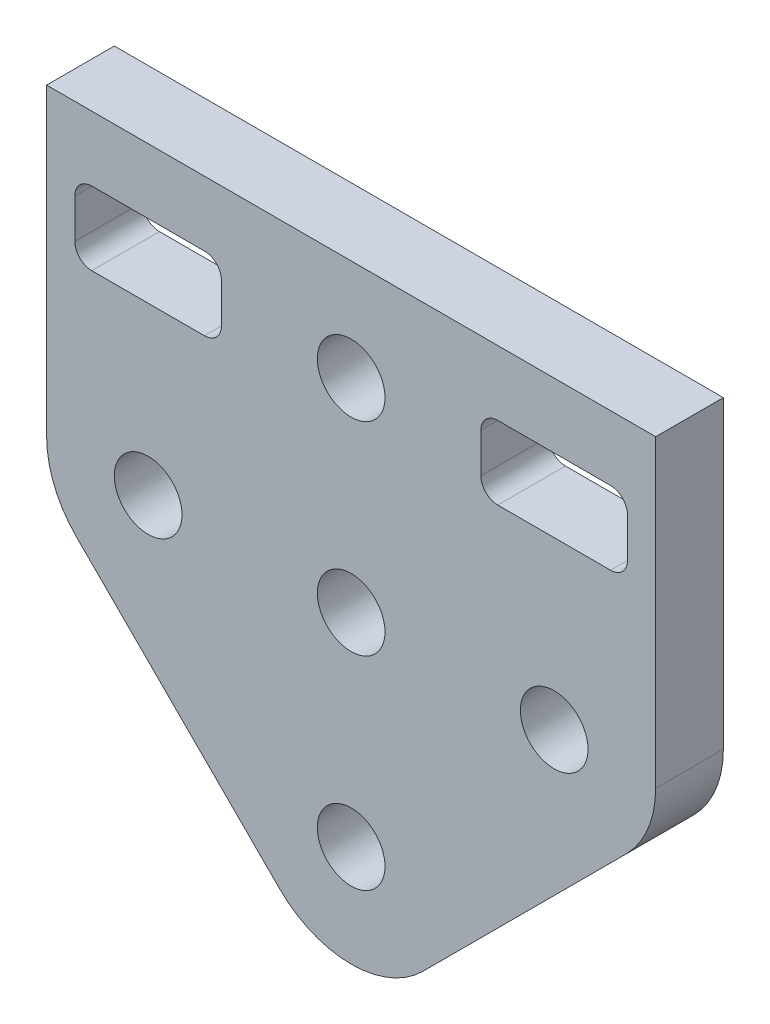
ISO-10303-21;
HEADER;
FILE_DESCRIPTION(('STEP AP214'),'2;1');
FILE_NAME('part.step','',(''),(''),'','','');
FILE_SCHEMA(('AUTOMOTIVE_DESIGN { 1 0 10303 214 1 1 1 1 }'));
ENDSEC;
DATA;
#1=APPLICATION_CONTEXT('core data for automotive mechanical design processes');
#2=APPLICATION_PROTOCOL_DEFINITION('international standard','automotive_design',2000,#1);
#3=PRODUCT_CONTEXT('',#1,'mechanical');
#4=PRODUCT('Part','Part','',(#3));
#5=PRODUCT_RELATED_PRODUCT_CATEGORY('part','',(#4));
#6=PRODUCT_DEFINITION_FORMATION('','',#4);
#7=PRODUCT_DEFINITION_CONTEXT('part definition',#1,'design');
#8=PRODUCT_DEFINITION('design','',#6,#7);
#9=PRODUCT_DEFINITION_SHAPE('','',#8);
#10=(LENGTH_UNIT() NAMED_UNIT(*) SI_UNIT(.MILLI.,.METRE.));
#11=(NAMED_UNIT(*) PLANE_ANGLE_UNIT() SI_UNIT($,.RADIAN.));
#12=(NAMED_UNIT(*) SI_UNIT($,.STERADIAN.) SOLID_ANGLE_UNIT());
#13=UNCERTAINTY_MEASURE_WITH_UNIT(LENGTH_MEASURE(1.E-05),#10,'distance_accuracy_value','');
#14=(GEOMETRIC_REPRESENTATION_CONTEXT(3) GLOBAL_UNCERTAINTY_ASSIGNED_CONTEXT((#13)) GLOBAL_UNIT_ASSIGNED_CONTEXT((#10,
#11,#12)) REPRESENTATION_CONTEXT('',''));
#15=CARTESIAN_POINT('',(0.,0.,0.));
#16=DIRECTION('',(0.,0.,1.));
#17=DIRECTION('',(1.,0.,0.));
#18=AXIS2_PLACEMENT_3D('',#15,#16,#17);
#19=CARTESIAN_POINT('',(187.7270545748,195.1787200631,3.));
#20=DIRECTION('',(0.,0.,1.));
#21=DIRECTION('',(1.,0.,0.));
#22=AXIS2_PLACEMENT_3D('',#19,#20,#21);
#23=PLANE('',#22);
#24=DIRECTION('',(0.,-1.,0.));
#25=VECTOR('',#24,1.);
#26=CARTESIAN_POINT('',(193.4770545748,214.0537200631,3.));
#27=LINE('',#26,#25);
#28=CARTESIAN_POINT('',(193.4770545748,214.0537200631,3.));
#29=VERTEX_POINT('',#28);
#30=CARTESIAN_POINT('',(193.4770545748,212.3037200631,3.));
#31=VERTEX_POINT('',#30);
#32=EDGE_CURVE('E261',#29,#31,#27,.T.);
#33=ORIENTED_EDGE('',*,*,#32,.F.);
#34=CARTESIAN_POINT('',(194.2270545748,214.0537200631,3.));
#35=DIRECTION('',(0.,0.,1.));
#36=DIRECTION('',(1.,0.,0.));
#37=AXIS2_PLACEMENT_3D('',#34,#35,#36);
#38=CIRCLE('',#37,0.750000000000001);
#39=CARTESIAN_POINT('',(194.2270545748,214.8037200631,3.));
#40=VERTEX_POINT('',#39);
#41=EDGE_CURVE('E259',#40,#29,#38,.T.);
#42=ORIENTED_EDGE('',*,*,#41,.F.);
#43=DIRECTION('',(-1.,0.,0.));
#44=VECTOR('',#43,1.);
#45=CARTESIAN_POINT('',(199.2270545748,214.8037200631,3.));
#46=LINE('',#45,#44);
#47=CARTESIAN_POINT('',(199.2270545748,214.8037200631,3.));
#48=VERTEX_POINT('',#47);
#49=EDGE_CURVE('E275',#48,#40,#46,.T.);
#50=ORIENTED_EDGE('',*,*,#49,.F.);
#51=CARTESIAN_POINT('',(199.2270545748,214.0537200631,3.));
#52=DIRECTION('',(0.,0.,1.));
#53=DIRECTION('',(1.,0.,0.));
#54=AXIS2_PLACEMENT_3D('',#51,#52,#53);
#55=CIRCLE('',#54,0.750000000000001);
#56=CARTESIAN_POINT('',(199.9770545748,214.0537200631,3.));
#57=VERTEX_POINT('',#56);
#58=EDGE_CURVE('E272',#57,#48,#55,.T.);
#59=ORIENTED_EDGE('',*,*,#58,.F.);
#60=DIRECTION('',(0.,1.,0.));
#61=VECTOR('',#60,1.);
#62=CARTESIAN_POINT('',(199.9770545748,212.3037200631,3.));
#63=LINE('',#62,#61);
#64=CARTESIAN_POINT('',(199.9770545748,212.3037200631,3.));
#65=VERTEX_POINT('',#64);
#66=EDGE_CURVE('E270',#65,#57,#63,.T.);
#67=ORIENTED_EDGE('',*,*,#66,.F.);
#68=CARTESIAN_POINT('',(199.2270545748,212.3037200631,3.));
#69=DIRECTION('',(0.,0.,1.));
#70=DIRECTION('',(1.,0.,0.));
#71=AXIS2_PLACEMENT_3D('',#68,#69,#70);
#72=CIRCLE('',#71,0.750000000000001);
#73=CARTESIAN_POINT('',(199.2270545748,211.5537200631,3.));
#74=VERTEX_POINT('',#73);
#75=EDGE_CURVE('E268',#74,#65,#72,.T.);
#76=ORIENTED_EDGE('',*,*,#75,.F.);
#77=DIRECTION('',(1.,0.,0.));
#78=VECTOR('',#77,1.);
#79=CARTESIAN_POINT('',(194.2270545748,211.5537200631,3.));
#80=LINE('',#79,#78);
#81=CARTESIAN_POINT('',(194.2270545748,211.5537200631,3.));
#82=VERTEX_POINT('',#81);
#83=EDGE_CURVE('E266',#82,#74,#80,.T.);
#84=ORIENTED_EDGE('',*,*,#83,.F.);
#85=CARTESIAN_POINT('',(194.2270545748,212.3037200631,3.));
#86=DIRECTION('',(0.,0.,1.));
#87=DIRECTION('',(1.,0.,0.));
#88=AXIS2_PLACEMENT_3D('',#85,#86,#87);
#89=CIRCLE('',#88,0.750000000000001);
#90=EDGE_CURVE('E264',#31,#82,#89,.T.);
#91=ORIENTED_EDGE('',*,*,#90,.F.);
#92=EDGE_LOOP('',(#33,#42,#50,#59,#67,#76,#84,#91));
#93=FACE_BOUND('',#92,.T.);
#94=CARTESIAN_POINT('',(187.7270545748,195.1787200631,3.));
#95=DIRECTION('',(0.,0.,1.));
#96=DIRECTION('',(1.,0.,0.));
#97=AXIS2_PLACEMENT_3D('',#94,#95,#96);
#98=CIRCLE('',#97,1.5);
#99=CARTESIAN_POINT('',(189.2270545748,195.1787200631,3.));
#100=VERTEX_POINT('',#99);
#101=EDGE_CURVE('E324',#100,#100,#98,.T.);
#102=ORIENTED_EDGE('',*,*,#101,.F.);
#103=EDGE_LOOP('',(#102));
#104=FACE_BOUND('',#103,.T.);
#105=CARTESIAN_POINT('',(178.7270545748,204.1787200631,3.));
#106=DIRECTION('',(0.,0.,1.));
#107=DIRECTION('',(1.,0.,0.));
#108=AXIS2_PLACEMENT_3D('',#105,#106,#107);
#109=CIRCLE('',#108,1.5);
#110=CARTESIAN_POINT('',(180.2270545748,204.1787200631,3.));
#111=VERTEX_POINT('',#110);
#112=EDGE_CURVE('E336',#111,#111,#109,.T.);
#113=ORIENTED_EDGE('',*,*,#112,.F.);
#114=EDGE_LOOP('',(#113));
#115=FACE_BOUND('',#114,.T.);
#116=CARTESIAN_POINT('',(187.7270545748,195.1787200631,3.));
#117=DIRECTION('',(0.,0.,1.));
#118=DIRECTION('',(1.,0.,0.));
#119=AXIS2_PLACEMENT_3D('',#116,#117,#118);
#120=CIRCLE('',#119,4.50000000005025);
#121=CARTESIAN_POINT('',(184.5450740594,191.9967395477,3.));
#122=VERTEX_POINT('',#121);
#123=CARTESIAN_POINT('',(190.9090350901,191.9967395477,3.));
#124=VERTEX_POINT('',#123);
#125=EDGE_CURVE('E348',#122,#124,#120,.T.);
#126=ORIENTED_EDGE('',*,*,#125,.T.);
#127=DIRECTION('',(0.707106781186548,0.707106781186548,0.));
#128=VECTOR('',#127,1.);
#129=CARTESIAN_POINT('',(190.9090350901,191.9967395477,3.));
#130=LINE('',#129,#128);
#131=CARTESIAN_POINT('',(199.909035090095,200.996739547705,3.));
#132=VERTEX_POINT('',#131);
#133=EDGE_CURVE('E351',#124,#132,#130,.T.);
#134=ORIENTED_EDGE('',*,*,#133,.T.);
#135=CARTESIAN_POINT('',(196.7270545748,204.1787200631,3.));
#136=DIRECTION('',(0.,0.,1.));
#137=DIRECTION('',(1.,0.,0.));
#138=AXIS2_PLACEMENT_3D('',#135,#136,#137);
#139=CIRCLE('',#138,4.50000000000745);
#140=CARTESIAN_POINT('',(201.2270545748,204.1787200631,3.));
#141=VERTEX_POINT('',#140);
#142=EDGE_CURVE('E354',#132,#141,#139,.T.);
#143=ORIENTED_EDGE('',*,*,#142,.T.);
#144=DIRECTION('',(0.,1.,0.));
#145=VECTOR('',#144,1.);
#146=CARTESIAN_POINT('',(201.2270545748,217.6787200631,3.));
#147=LINE('',#146,#145);
#148=CARTESIAN_POINT('',(201.2270545748,217.6787200631,3.));
#149=VERTEX_POINT('',#148);
#150=EDGE_CURVE('E356',#141,#149,#147,.T.);
#151=ORIENTED_EDGE('',*,*,#150,.T.);
#152=DIRECTION('',(-1.,0.,0.));
#153=VECTOR('',#152,1.);
#154=CARTESIAN_POINT('',(201.2270545748,217.6787200631,3.));
#155=LINE('',#154,#153);
#156=CARTESIAN_POINT('',(174.2270545748,217.6787200631,3.));
#157=VERTEX_POINT('',#156);
#158=EDGE_CURVE('E358',#149,#157,#155,.T.);
#159=ORIENTED_EDGE('',*,*,#158,.T.);
#160=DIRECTION('',(0.,-1.,0.));
#161=VECTOR('',#160,1.);
#162=CARTESIAN_POINT('',(174.2270545748,213.1787200631,3.));
#163=LINE('',#162,#161);
#164=CARTESIAN_POINT('',(174.227054574757,204.1787200631,3.));
#165=VERTEX_POINT('',#164);
#166=EDGE_CURVE('E360',#157,#165,#163,.T.);
#167=ORIENTED_EDGE('',*,*,#166,.T.);
#168=CARTESIAN_POINT('',(178.7270545748,204.1787200631,3.));
#169=DIRECTION('',(0.,0.,1.));
#170=DIRECTION('',(1.,0.,0.));
#171=AXIS2_PLACEMENT_3D('',#168,#169,#170);
#172=CIRCLE('',#171,4.50000000004281);
#173=CARTESIAN_POINT('',(175.5450740594,200.9967395477,3.));
#174=VERTEX_POINT('',#173);
#175=EDGE_CURVE('E362',#165,#174,#172,.T.);
#176=ORIENTED_EDGE('',*,*,#175,.T.);
#177=DIRECTION('',(0.707106781186548,-0.707106781186548,0.));
#178=VECTOR('',#177,1.);
#179=CARTESIAN_POINT('',(184.5450740594,191.9967395477,3.));
#180=LINE('',#179,#178);
#181=EDGE_CURVE('E364',#174,#122,#180,.T.);
#182=ORIENTED_EDGE('',*,*,#181,.T.);
#183=EDGE_LOOP('',(#126,#134,#143,#151,#159,#167,#176,#182));
#184=FACE_BOUND('',#183,.T.);
#185=CARTESIAN_POINT('',(187.7270545748,204.1787200631,3.));
#186=DIRECTION('',(0.,0.,1.));
#187=DIRECTION('',(1.,0.,0.));
#188=AXIS2_PLACEMENT_3D('',#185,#186,#187);
#189=CIRCLE('',#188,1.5);
#190=CARTESIAN_POINT('',(189.2270545748,204.1787200631,3.));
#191=VERTEX_POINT('',#190);
#192=EDGE_CURVE('E342',#191,#191,#189,.T.);
#193=ORIENTED_EDGE('',*,*,#192,.F.);
#194=EDGE_LOOP('',(#193));
#195=FACE_BOUND('',#194,.T.);
#196=CARTESIAN_POINT('',(187.7270545748,213.1787200631,3.));
#197=DIRECTION('',(0.,0.,1.));
#198=DIRECTION('',(1.,0.,0.));
#199=AXIS2_PLACEMENT_3D('',#196,#197,#198);
#200=CIRCLE('',#199,1.5);
#201=CARTESIAN_POINT('',(189.2270545748,213.1787200631,3.));
#202=VERTEX_POINT('',#201);
#203=EDGE_CURVE('E330',#202,#202,#200,.T.);
#204=ORIENTED_EDGE('',*,*,#203,.F.);
#205=EDGE_LOOP('',(#204));
#206=FACE_BOUND('',#205,.T.);
#207=CARTESIAN_POINT('',(196.7270545748,204.1787200631,3.));
#208=DIRECTION('',(0.,0.,1.));
#209=DIRECTION('',(1.,0.,0.));
#210=AXIS2_PLACEMENT_3D('',#207,#208,#209);
#211=CIRCLE('',#210,1.5);
#212=CARTESIAN_POINT('',(198.2270545748,204.1787200631,3.));
#213=VERTEX_POINT('',#212);
#214=EDGE_CURVE('E318',#213,#213,#211,.T.);
#215=ORIENTED_EDGE('',*,*,#214,.F.);
#216=EDGE_LOOP('',(#215));
#217=FACE_BOUND('',#216,.T.);
#218=DIRECTION('',(0.,-1.,0.));
#219=VECTOR('',#218,1.);
#220=CARTESIAN_POINT('',(175.4770545748,214.0537200631,3.));
#221=LINE('',#220,#219);
#222=CARTESIAN_POINT('',(175.4770545748,214.0537200631,3.));
#223=VERTEX_POINT('',#222);
#224=CARTESIAN_POINT('',(175.4770545748,212.3037200631,3.));
#225=VERTEX_POINT('',#224);
#226=EDGE_CURVE('E202',#223,#225,#221,.T.);
#227=ORIENTED_EDGE('',*,*,#226,.F.);
#228=CARTESIAN_POINT('',(176.2270545748,214.0537200631,3.));
#229=DIRECTION('',(0.,0.,1.));
#230=DIRECTION('',(1.,0.,0.));
#231=AXIS2_PLACEMENT_3D('',#228,#229,#230);
#232=CIRCLE('',#231,0.750000000000001);
#233=CARTESIAN_POINT('',(176.2270545748,214.8037200631,3.));
#234=VERTEX_POINT('',#233);
#235=EDGE_CURVE('E194',#234,#223,#232,.T.);
#236=ORIENTED_EDGE('',*,*,#235,.F.);
#237=DIRECTION('',(-1.,0.,0.));
#238=VECTOR('',#237,1.);
#239=CARTESIAN_POINT('',(181.2270545748,214.8037200631,3.));
#240=LINE('',#239,#238);
#241=CARTESIAN_POINT('',(181.2270545748,214.8037200631,3.));
#242=VERTEX_POINT('',#241);
#243=EDGE_CURVE('E227',#242,#234,#240,.T.);
#244=ORIENTED_EDGE('',*,*,#243,.F.);
#245=CARTESIAN_POINT('',(181.2270545748,214.0537200631,3.));
#246=DIRECTION('',(0.,0.,1.));
#247=DIRECTION('',(1.,0.,0.));
#248=AXIS2_PLACEMENT_3D('',#245,#246,#247);
#249=CIRCLE('',#248,0.750000000000001);
#250=CARTESIAN_POINT('',(181.9770545748,214.0537200631,3.));
#251=VERTEX_POINT('',#250);
#252=EDGE_CURVE('E225',#251,#242,#249,.T.);
#253=ORIENTED_EDGE('',*,*,#252,.F.);
#254=DIRECTION('',(0.,1.,0.));
#255=VECTOR('',#254,1.);
#256=CARTESIAN_POINT('',(181.9770545748,212.3037200631,3.));
#257=LINE('',#256,#255);
#258=CARTESIAN_POINT('',(181.9770545748,212.3037200631,3.));
#259=VERTEX_POINT('',#258);
#260=EDGE_CURVE('E223',#259,#251,#257,.T.);
#261=ORIENTED_EDGE('',*,*,#260,.F.);
#262=CARTESIAN_POINT('',(181.2270545748,212.3037200631,3.));
#263=DIRECTION('',(0.,0.,1.));
#264=DIRECTION('',(1.,0.,0.));
#265=AXIS2_PLACEMENT_3D('',#262,#263,#264);
#266=CIRCLE('',#265,0.750000000000001);
#267=CARTESIAN_POINT('',(181.2270545748,211.5537200631,3.));
#268=VERTEX_POINT('',#267);
#269=EDGE_CURVE('E221',#268,#259,#266,.T.);
#270=ORIENTED_EDGE('',*,*,#269,.F.);
#271=DIRECTION('',(1.,0.,0.));
#272=VECTOR('',#271,1.);
#273=CARTESIAN_POINT('',(176.2270545748,211.5537200631,3.));
#274=LINE('',#273,#272);
#275=CARTESIAN_POINT('',(176.2270545748,211.5537200631,3.));
#276=VERTEX_POINT('',#275);
#277=EDGE_CURVE('E217',#276,#268,#274,.T.);
#278=ORIENTED_EDGE('',*,*,#277,.F.);
#279=CARTESIAN_POINT('',(176.2270545748,212.3037200631,3.));
#280=DIRECTION('',(0.,0.,1.));
#281=DIRECTION('',(1.,0.,0.));
#282=AXIS2_PLACEMENT_3D('',#279,#280,#281);
#283=CIRCLE('',#282,0.750000000000001);
#284=EDGE_CURVE('E215',#225,#276,#283,.T.);
#285=ORIENTED_EDGE('',*,*,#284,.F.);
#286=EDGE_LOOP('',(#227,#236,#244,#253,#261,#270,#278,#285));
#287=FACE_BOUND('',#286,.T.);
#288=ADVANCED_FACE('F33',(#93,#104,#115,#184,#195,#206,#217,#287),#23,.T.);
#289=CARTESIAN_POINT('',(187.7270545748,195.1787200631,0.));
#290=DIRECTION('',(0.,0.,1.));
#291=DIRECTION('',(1.,0.,0.));
#292=AXIS2_PLACEMENT_3D('',#289,#290,#291);
#293=PLANE('',#292);
#294=CARTESIAN_POINT('',(194.2270545748,214.0537200631,0.));
#295=DIRECTION('',(0.,0.,1.));
#296=DIRECTION('',(1.,0.,0.));
#297=AXIS2_PLACEMENT_3D('',#294,#295,#296);
#298=CIRCLE('',#297,0.750000000000001);
#299=CARTESIAN_POINT('',(194.2270545748,214.8037200631,0.));
#300=VERTEX_POINT('',#299);
#301=CARTESIAN_POINT('',(193.4770545748,214.0537200631,0.));
#302=VERTEX_POINT('',#301);
#303=EDGE_CURVE('E210',#300,#302,#298,.T.);
#304=ORIENTED_EDGE('',*,*,#303,.T.);
#305=DIRECTION('',(0.,-1.,0.));
#306=VECTOR('',#305,1.);
#307=CARTESIAN_POINT('',(193.4770545748,214.0537200631,0.));
#308=LINE('',#307,#306);
#309=CARTESIAN_POINT('',(193.4770545748,212.3037200631,0.));
#310=VERTEX_POINT('',#309);
#311=EDGE_CURVE('E280',#302,#310,#308,.T.);
#312=ORIENTED_EDGE('',*,*,#311,.T.);
#313=CARTESIAN_POINT('',(194.2270545748,212.3037200631,0.));
#314=DIRECTION('',(0.,0.,1.));
#315=DIRECTION('',(1.,0.,0.));
#316=AXIS2_PLACEMENT_3D('',#313,#314,#315);
#317=CIRCLE('',#316,0.750000000000001);
#318=CARTESIAN_POINT('',(194.2270545748,211.5537200631,0.));
#319=VERTEX_POINT('',#318);
#320=EDGE_CURVE('E283',#310,#319,#317,.T.);
#321=ORIENTED_EDGE('',*,*,#320,.T.);
#322=DIRECTION('',(1.,0.,0.));
#323=VECTOR('',#322,1.);
#324=CARTESIAN_POINT('',(194.2270545748,211.5537200631,0.));
#325=LINE('',#324,#323);
#326=CARTESIAN_POINT('',(199.2270545748,211.5537200631,0.));
#327=VERTEX_POINT('',#326);
#328=EDGE_CURVE('E286',#319,#327,#325,.T.);
#329=ORIENTED_EDGE('',*,*,#328,.T.);
#330=CARTESIAN_POINT('',(199.2270545748,212.3037200631,0.));
#331=DIRECTION('',(0.,0.,1.));
#332=DIRECTION('',(1.,0.,0.));
#333=AXIS2_PLACEMENT_3D('',#330,#331,#332);
#334=CIRCLE('',#333,0.750000000000001);
#335=CARTESIAN_POINT('',(199.9770545748,212.3037200631,0.));
#336=VERTEX_POINT('',#335);
#337=EDGE_CURVE('E289',#327,#336,#334,.T.);
#338=ORIENTED_EDGE('',*,*,#337,.T.);
#339=DIRECTION('',(0.,1.,0.));
#340=VECTOR('',#339,1.);
#341=CARTESIAN_POINT('',(199.9770545748,212.3037200631,0.));
#342=LINE('',#341,#340);
#343=CARTESIAN_POINT('',(199.9770545748,214.0537200631,0.));
#344=VERTEX_POINT('',#343);
#345=EDGE_CURVE('E292',#336,#344,#342,.T.);
#346=ORIENTED_EDGE('',*,*,#345,.T.);
#347=CARTESIAN_POINT('',(199.2270545748,214.0537200631,0.));
#348=DIRECTION('',(0.,0.,1.));
#349=DIRECTION('',(1.,0.,0.));
#350=AXIS2_PLACEMENT_3D('',#347,#348,#349);
#351=CIRCLE('',#350,0.750000000000001);
#352=CARTESIAN_POINT('',(199.2270545748,214.8037200631,0.));
#353=VERTEX_POINT('',#352);
#354=EDGE_CURVE('E295',#344,#353,#351,.T.);
#355=ORIENTED_EDGE('',*,*,#354,.T.);
#356=DIRECTION('',(-1.,0.,0.));
#357=VECTOR('',#356,1.);
#358=CARTESIAN_POINT('',(199.2270545748,214.8037200631,0.));
#359=LINE('',#358,#357);
#360=EDGE_CURVE('E262',#353,#300,#359,.T.);
#361=ORIENTED_EDGE('',*,*,#360,.T.);
#362=EDGE_LOOP('',(#304,#312,#321,#329,#338,#346,#355,#361));
#363=FACE_BOUND('',#362,.T.);
#364=CARTESIAN_POINT('',(187.7270545748,195.1787200631,0.));
#365=DIRECTION('',(0.,0.,1.));
#366=DIRECTION('',(1.,0.,0.));
#367=AXIS2_PLACEMENT_3D('',#364,#365,#366);
#368=CIRCLE('',#367,1.5);
#369=CARTESIAN_POINT('',(189.2270545748,195.1787200631,0.));
#370=VERTEX_POINT('',#369);
#371=EDGE_CURVE('E321',#370,#370,#368,.T.);
#372=ORIENTED_EDGE('',*,*,#371,.T.);
#373=EDGE_LOOP('',(#372));
#374=FACE_BOUND('',#373,.T.);
#375=CARTESIAN_POINT('',(178.7270545748,204.1787200631,0.));
#376=DIRECTION('',(0.,0.,1.));
#377=DIRECTION('',(1.,0.,0.));
#378=AXIS2_PLACEMENT_3D('',#375,#376,#377);
#379=CIRCLE('',#378,1.5);
#380=CARTESIAN_POINT('',(180.2270545748,204.1787200631,0.));
#381=VERTEX_POINT('',#380);
#382=EDGE_CURVE('E333',#381,#381,#379,.T.);
#383=ORIENTED_EDGE('',*,*,#382,.T.);
#384=EDGE_LOOP('',(#383));
#385=FACE_BOUND('',#384,.T.);
#386=CARTESIAN_POINT('',(187.7270545748,195.1787200631,0.));
#387=DIRECTION('',(0.,0.,1.));
#388=DIRECTION('',(1.,0.,0.));
#389=AXIS2_PLACEMENT_3D('',#386,#387,#388);
#390=CIRCLE('',#389,4.50000000005025);
#391=CARTESIAN_POINT('',(184.5450740594,191.9967395477,0.));
#392=VERTEX_POINT('',#391);
#393=CARTESIAN_POINT('',(190.9090350901,191.9967395477,0.));
#394=VERTEX_POINT('',#393);
#395=EDGE_CURVE('E345',#392,#394,#390,.T.);
#396=ORIENTED_EDGE('',*,*,#395,.F.);
#397=DIRECTION('',(0.707106781186548,-0.707106781186548,0.));
#398=VECTOR('',#397,1.);
#399=CARTESIAN_POINT('',(184.5450740594,191.9967395477,0.));
#400=LINE('',#399,#398);
#401=CARTESIAN_POINT('',(175.5450740594,200.9967395477,0.));
#402=VERTEX_POINT('',#401);
#403=EDGE_CURVE('E352',#402,#392,#400,.T.);
#404=ORIENTED_EDGE('',*,*,#403,.F.);
#405=CARTESIAN_POINT('',(178.7270545748,204.1787200631,0.));
#406=DIRECTION('',(0.,0.,1.));
#407=DIRECTION('',(1.,0.,0.));
#408=AXIS2_PLACEMENT_3D('',#405,#406,#407);
#409=CIRCLE('',#408,4.50000000004281);
#410=CARTESIAN_POINT('',(174.227054574757,204.1787200631,0.));
#411=VERTEX_POINT('',#410);
#412=EDGE_CURVE('E380',#411,#402,#409,.T.);
#413=ORIENTED_EDGE('',*,*,#412,.F.);
#414=DIRECTION('',(0.,-1.,0.));
#415=VECTOR('',#414,1.);
#416=CARTESIAN_POINT('',(174.2270545748,213.1787200631,0.));
#417=LINE('',#416,#415);
#418=CARTESIAN_POINT('',(174.2270545748,217.6787200631,0.));
#419=VERTEX_POINT('',#418);
#420=EDGE_CURVE('E378',#419,#411,#417,.T.);
#421=ORIENTED_EDGE('',*,*,#420,.F.);
#422=DIRECTION('',(-1.,0.,0.));
#423=VECTOR('',#422,1.);
#424=CARTESIAN_POINT('',(201.2270545748,217.6787200631,0.));
#425=LINE('',#424,#423);
#426=CARTESIAN_POINT('',(201.2270545748,217.6787200631,0.));
#427=VERTEX_POINT('',#426);
#428=EDGE_CURVE('E375',#427,#419,#425,.T.);
#429=ORIENTED_EDGE('',*,*,#428,.F.);
#430=DIRECTION('',(0.,1.,0.));
#431=VECTOR('',#430,1.);
#432=CARTESIAN_POINT('',(201.2270545748,217.6787200631,0.));
#433=LINE('',#432,#431);
#434=CARTESIAN_POINT('',(201.2270545748,204.1787200631,0.));
#435=VERTEX_POINT('',#434);
#436=EDGE_CURVE('E373',#435,#427,#433,.T.);
#437=ORIENTED_EDGE('',*,*,#436,.F.);
#438=CARTESIAN_POINT('',(196.7270545748,204.1787200631,0.));
#439=DIRECTION('',(0.,0.,1.));
#440=DIRECTION('',(1.,0.,0.));
#441=AXIS2_PLACEMENT_3D('',#438,#439,#440);
#442=CIRCLE('',#441,4.50000000000745);
#443=CARTESIAN_POINT('',(199.909035090095,200.996739547705,0.));
#444=VERTEX_POINT('',#443);
#445=EDGE_CURVE('E371',#444,#435,#442,.T.);
#446=ORIENTED_EDGE('',*,*,#445,.F.);
#447=DIRECTION('',(0.707106781186548,0.707106781186548,0.));
#448=VECTOR('',#447,1.);
#449=CARTESIAN_POINT('',(190.9090350901,191.9967395477,0.));
#450=LINE('',#449,#448);
#451=EDGE_CURVE('E369',#394,#444,#450,.T.);
#452=ORIENTED_EDGE('',*,*,#451,.F.);
#453=EDGE_LOOP('',(#396,#404,#413,#421,#429,#437,#446,#452));
#454=FACE_BOUND('',#453,.T.);
#455=CARTESIAN_POINT('',(187.7270545748,204.1787200631,0.));
#456=DIRECTION('',(0.,0.,1.));
#457=DIRECTION('',(1.,0.,0.));
#458=AXIS2_PLACEMENT_3D('',#455,#456,#457);
#459=CIRCLE('',#458,1.5);
#460=CARTESIAN_POINT('',(189.2270545748,204.1787200631,0.));
#461=VERTEX_POINT('',#460);
#462=EDGE_CURVE('E339',#461,#461,#459,.T.);
#463=ORIENTED_EDGE('',*,*,#462,.T.);
#464=EDGE_LOOP('',(#463));
#465=FACE_BOUND('',#464,.T.);
#466=CARTESIAN_POINT('',(187.7270545748,213.1787200631,0.));
#467=DIRECTION('',(0.,0.,1.));
#468=DIRECTION('',(1.,0.,0.));
#469=AXIS2_PLACEMENT_3D('',#466,#467,#468);
#470=CIRCLE('',#469,1.5);
#471=CARTESIAN_POINT('',(189.2270545748,213.1787200631,0.));
#472=VERTEX_POINT('',#471);
#473=EDGE_CURVE('E327',#472,#472,#470,.T.);
#474=ORIENTED_EDGE('',*,*,#473,.T.);
#475=EDGE_LOOP('',(#474));
#476=FACE_BOUND('',#475,.T.);
#477=CARTESIAN_POINT('',(196.7270545748,204.1787200631,0.));
#478=DIRECTION('',(0.,0.,1.));
#479=DIRECTION('',(1.,0.,0.));
#480=AXIS2_PLACEMENT_3D('',#477,#478,#479);
#481=CIRCLE('',#480,1.5);
#482=CARTESIAN_POINT('',(198.2270545748,204.1787200631,0.));
#483=VERTEX_POINT('',#482);
#484=EDGE_CURVE('E317',#483,#483,#481,.T.);
#485=ORIENTED_EDGE('',*,*,#484,.T.);
#486=EDGE_LOOP('',(#485));
#487=FACE_BOUND('',#486,.T.);
#488=CARTESIAN_POINT('',(176.2270545748,214.0537200631,0.));
#489=DIRECTION('',(0.,0.,1.));
#490=DIRECTION('',(1.,0.,0.));
#491=AXIS2_PLACEMENT_3D('',#488,#489,#490);
#492=CIRCLE('',#491,0.750000000000001);
#493=CARTESIAN_POINT('',(176.2270545748,214.8037200631,0.));
#494=VERTEX_POINT('',#493);
#495=CARTESIAN_POINT('',(175.4770545748,214.0537200631,0.));
#496=VERTEX_POINT('',#495);
#497=EDGE_CURVE('E56',#494,#496,#492,.T.);
#498=ORIENTED_EDGE('',*,*,#497,.T.);
#499=DIRECTION('',(0.,-1.,0.));
#500=VECTOR('',#499,1.);
#501=CARTESIAN_POINT('',(175.4770545748,214.0537200631,0.));
#502=LINE('',#501,#500);
#503=CARTESIAN_POINT('',(175.4770545748,212.3037200631,0.));
#504=VERTEX_POINT('',#503);
#505=EDGE_CURVE('E209',#496,#504,#502,.T.);
#506=ORIENTED_EDGE('',*,*,#505,.T.);
#507=CARTESIAN_POINT('',(176.2270545748,212.3037200631,0.));
#508=DIRECTION('',(0.,0.,1.));
#509=DIRECTION('',(1.,0.,0.));
#510=AXIS2_PLACEMENT_3D('',#507,#508,#509);
#511=CIRCLE('',#510,0.750000000000001);
#512=CARTESIAN_POINT('',(176.2270545748,211.5537200631,0.));
#513=VERTEX_POINT('',#512);
#514=EDGE_CURVE('E231',#504,#513,#511,.T.);
#515=ORIENTED_EDGE('',*,*,#514,.T.);
#516=DIRECTION('',(1.,0.,0.));
#517=VECTOR('',#516,1.);
#518=CARTESIAN_POINT('',(176.2270545748,211.5537200631,0.));
#519=LINE('',#518,#517);
#520=CARTESIAN_POINT('',(181.2270545748,211.5537200631,0.));
#521=VERTEX_POINT('',#520);
#522=EDGE_CURVE('E234',#513,#521,#519,.T.);
#523=ORIENTED_EDGE('',*,*,#522,.T.);
#524=CARTESIAN_POINT('',(181.2270545748,212.3037200631,0.));
#525=DIRECTION('',(0.,0.,1.));
#526=DIRECTION('',(1.,0.,0.));
#527=AXIS2_PLACEMENT_3D('',#524,#525,#526);
#528=CIRCLE('',#527,0.750000000000001);
#529=CARTESIAN_POINT('',(181.9770545748,212.3037200631,0.));
#530=VERTEX_POINT('',#529);
#531=EDGE_CURVE('E237',#521,#530,#528,.T.);
#532=ORIENTED_EDGE('',*,*,#531,.T.);
#533=DIRECTION('',(0.,1.,0.));
#534=VECTOR('',#533,1.);
#535=CARTESIAN_POINT('',(181.9770545748,212.3037200631,0.));
#536=LINE('',#535,#534);
#537=CARTESIAN_POINT('',(181.9770545748,214.0537200631,0.));
#538=VERTEX_POINT('',#537);
#539=EDGE_CURVE('E240',#530,#538,#536,.T.);
#540=ORIENTED_EDGE('',*,*,#539,.T.);
#541=CARTESIAN_POINT('',(181.2270545748,214.0537200631,0.));
#542=DIRECTION('',(0.,0.,1.));
#543=DIRECTION('',(1.,0.,0.));
#544=AXIS2_PLACEMENT_3D('',#541,#542,#543);
#545=CIRCLE('',#544,0.750000000000001);
#546=CARTESIAN_POINT('',(181.2270545748,214.8037200631,0.));
#547=VERTEX_POINT('',#546);
#548=EDGE_CURVE('E243',#538,#547,#545,.T.);
#549=ORIENTED_EDGE('',*,*,#548,.T.);
#550=DIRECTION('',(-1.,0.,0.));
#551=VECTOR('',#550,1.);
#552=CARTESIAN_POINT('',(181.2270545748,214.8037200631,0.));
#553=LINE('',#552,#551);
#554=EDGE_CURVE('E203',#547,#494,#553,.T.);
#555=ORIENTED_EDGE('',*,*,#554,.T.);
#556=EDGE_LOOP('',(#498,#506,#515,#523,#532,#540,#549,#555));
#557=FACE_BOUND('',#556,.T.);
#558=ADVANCED_FACE('F410',(#363,#374,#385,#454,#465,#476,#487,#557),#293,.F.);
#559=CARTESIAN_POINT('',(187.7270545748,195.1787200631,3.));
#560=DIRECTION('',(0.,0.,-1.));
#561=DIRECTION('',(-1.,0.,0.));
#562=AXIS2_PLACEMENT_3D('',#559,#560,#561);
#563=CYLINDRICAL_SURFACE('',#562,4.50000000005025);
#564=ORIENTED_EDGE('',*,*,#395,.T.);
#565=DIRECTION('',(0.,0.,-1.));
#566=VECTOR('',#565,1.);
#567=CARTESIAN_POINT('',(190.9090350901,191.9967395477,3.));
#568=LINE('',#567,#566);
#569=EDGE_CURVE('E11',#124,#394,#568,.T.);
#570=ORIENTED_EDGE('',*,*,#569,.F.);
#571=ORIENTED_EDGE('',*,*,#125,.F.);
#572=DIRECTION('',(0.,0.,-1.));
#573=VECTOR('',#572,1.);
#574=CARTESIAN_POINT('',(184.5450740594,191.9967395477,3.));
#575=LINE('',#574,#573);
#576=EDGE_CURVE('E366',#122,#392,#575,.T.);
#577=ORIENTED_EDGE('',*,*,#576,.T.);
#578=EDGE_LOOP('',(#564,#570,#571,#577));
#579=FACE_BOUND('',#578,.T.);
#580=ADVANCED_FACE('F35',(#579),#563,.T.);
#581=CARTESIAN_POINT('',(190.9090350901,191.9967395477,3.));
#582=DIRECTION('',(-0.707106781186547,0.707106781186547,0.));
#583=DIRECTION('',(-0.707106781186548,-0.707106781186548,0.));
#584=AXIS2_PLACEMENT_3D('',#581,#582,#583);
#585=PLANE('',#584);
#586=ORIENTED_EDGE('',*,*,#451,.T.);
#587=DIRECTION('',(0.,0.,-1.));
#588=VECTOR('',#587,1.);
#589=CARTESIAN_POINT('',(199.909035090095,200.996739547705,3.));
#590=LINE('',#589,#588);
#591=EDGE_CURVE('E41',#132,#444,#590,.T.);
#592=ORIENTED_EDGE('',*,*,#591,.F.);
#593=ORIENTED_EDGE('',*,*,#133,.F.);
#594=ORIENTED_EDGE('',*,*,#569,.T.);
#595=EDGE_LOOP('',(#586,#592,#593,#594));
#596=FACE_BOUND('',#595,.T.);
#597=ADVANCED_FACE('F427',(#596),#585,.F.);
#598=CARTESIAN_POINT('',(196.7270545748,204.1787200631,3.));
#599=DIRECTION('',(0.,0.,-1.));
#600=DIRECTION('',(-1.,0.,0.));
#601=AXIS2_PLACEMENT_3D('',#598,#599,#600);
#602=CYLINDRICAL_SURFACE('',#601,4.50000000000745);
#603=ORIENTED_EDGE('',*,*,#445,.T.);
#604=DIRECTION('',(0.,0.,-1.));
#605=VECTOR('',#604,1.);
#606=CARTESIAN_POINT('',(201.2270545748,204.1787200631,3.));
#607=LINE('',#606,#605);
#608=EDGE_CURVE('E397',#141,#435,#607,.T.);
#609=ORIENTED_EDGE('',*,*,#608,.F.);
#610=ORIENTED_EDGE('',*,*,#142,.F.);
#611=ORIENTED_EDGE('',*,*,#591,.T.);
#612=EDGE_LOOP('',(#603,#609,#610,#611));
#613=FACE_BOUND('',#612,.T.);
#614=ADVANCED_FACE('F404',(#613),#602,.T.);
#615=CARTESIAN_POINT('',(201.2270545748,217.6787200631,3.));
#616=DIRECTION('',(-1.,0.,0.));
#617=DIRECTION('',(0.,0.,1.));
#618=AXIS2_PLACEMENT_3D('',#615,#616,#617);
#619=PLANE('',#618);
#620=ORIENTED_EDGE('',*,*,#436,.T.);
#621=DIRECTION('',(0.,0.,-1.));
#622=VECTOR('',#621,1.);
#623=CARTESIAN_POINT('',(201.2270545748,217.6787200631,3.));
#624=LINE('',#623,#622);
#625=EDGE_CURVE('E394',#149,#427,#624,.T.);
#626=ORIENTED_EDGE('',*,*,#625,.F.);
#627=ORIENTED_EDGE('',*,*,#150,.F.);
#628=ORIENTED_EDGE('',*,*,#608,.T.);
#629=EDGE_LOOP('',(#620,#626,#627,#628));
#630=FACE_BOUND('',#629,.T.);
#631=ADVANCED_FACE('F415',(#630),#619,.F.);
#632=CARTESIAN_POINT('',(201.2270545748,217.6787200631,3.));
#633=DIRECTION('',(0.,-1.,0.));
#634=DIRECTION('',(0.,0.,-1.));
#635=AXIS2_PLACEMENT_3D('',#632,#633,#634);
#636=PLANE('',#635);
#637=ORIENTED_EDGE('',*,*,#428,.T.);
#638=DIRECTION('',(0.,0.,-1.));
#639=VECTOR('',#638,1.);
#640=CARTESIAN_POINT('',(174.2270545748,217.6787200631,3.));
#641=LINE('',#640,#639);
#642=EDGE_CURVE('E391',#157,#419,#641,.T.);
#643=ORIENTED_EDGE('',*,*,#642,.F.);
#644=ORIENTED_EDGE('',*,*,#158,.F.);
#645=ORIENTED_EDGE('',*,*,#625,.T.);
#646=EDGE_LOOP('',(#637,#643,#644,#645));
#647=FACE_BOUND('',#646,.T.);
#648=ADVANCED_FACE('F419',(#647),#636,.F.);
#649=CARTESIAN_POINT('',(174.2270545748,213.1787200631,3.));
#650=DIRECTION('',(1.,0.,0.));
#651=DIRECTION('',(0.,0.,-1.));
#652=AXIS2_PLACEMENT_3D('',#649,#650,#651);
#653=PLANE('',#652);
#654=ORIENTED_EDGE('',*,*,#420,.T.);
#655=DIRECTION('',(0.,0.,-1.));
#656=VECTOR('',#655,1.);
#657=CARTESIAN_POINT('',(174.227054574757,204.1787200631,3.));
#658=LINE('',#657,#656);
#659=EDGE_CURVE('E388',#165,#411,#658,.T.);
#660=ORIENTED_EDGE('',*,*,#659,.F.);
#661=ORIENTED_EDGE('',*,*,#166,.F.);
#662=ORIENTED_EDGE('',*,*,#642,.T.);
#663=EDGE_LOOP('',(#654,#660,#661,#662));
#664=FACE_BOUND('',#663,.T.);
#665=ADVANCED_FACE('F440',(#664),#653,.F.);
#666=CARTESIAN_POINT('',(178.7270545748,204.1787200631,3.));
#667=DIRECTION('',(0.,0.,-1.));
#668=DIRECTION('',(-1.,0.,0.));
#669=AXIS2_PLACEMENT_3D('',#666,#667,#668);
#670=CYLINDRICAL_SURFACE('',#669,4.50000000004281);
#671=ORIENTED_EDGE('',*,*,#412,.T.);
#672=DIRECTION('',(0.,0.,-1.));
#673=VECTOR('',#672,1.);
#674=CARTESIAN_POINT('',(175.5450740594,200.9967395477,3.));
#675=LINE('',#674,#673);
#676=EDGE_CURVE('E385',#174,#402,#675,.T.);
#677=ORIENTED_EDGE('',*,*,#676,.F.);
#678=ORIENTED_EDGE('',*,*,#175,.F.);
#679=ORIENTED_EDGE('',*,*,#659,.T.);
#680=EDGE_LOOP('',(#671,#677,#678,#679));
#681=FACE_BOUND('',#680,.T.);
#682=ADVANCED_FACE('F438',(#681),#670,.T.);
#683=CARTESIAN_POINT('',(184.5450740594,191.9967395477,3.));
#684=DIRECTION('',(0.707106781186547,0.707106781186547,0.));
#685=DIRECTION('',(-0.707106781186548,0.707106781186548,0.));
#686=AXIS2_PLACEMENT_3D('',#683,#684,#685);
#687=PLANE('',#686);
#688=ORIENTED_EDGE('',*,*,#403,.T.);
#689=ORIENTED_EDGE('',*,*,#576,.F.);
#690=ORIENTED_EDGE('',*,*,#181,.F.);
#691=ORIENTED_EDGE('',*,*,#676,.T.);
#692=EDGE_LOOP('',(#688,#689,#690,#691));
#693=FACE_BOUND('',#692,.T.);
#694=ADVANCED_FACE('F433',(#693),#687,.F.);
#695=CARTESIAN_POINT('',(187.7270545748,204.1787200631,3.));
#696=DIRECTION('',(0.,0.,-1.));
#697=DIRECTION('',(-1.,0.,0.));
#698=AXIS2_PLACEMENT_3D('',#695,#696,#697);
#699=CYLINDRICAL_SURFACE('',#698,1.5);
#700=ORIENTED_EDGE('',*,*,#192,.T.);
#701=EDGE_LOOP('',(#700));
#702=FACE_BOUND('',#701,.T.);
#703=ORIENTED_EDGE('',*,*,#462,.F.);
#704=EDGE_LOOP('',(#703));
#705=FACE_BOUND('',#704,.T.);
#706=ADVANCED_FACE('F460',(#702,#705),#699,.F.);
#707=CARTESIAN_POINT('',(178.7270545748,204.1787200631,3.));
#708=DIRECTION('',(0.,0.,-1.));
#709=DIRECTION('',(-1.,0.,0.));
#710=AXIS2_PLACEMENT_3D('',#707,#708,#709);
#711=CYLINDRICAL_SURFACE('',#710,1.5);
#712=ORIENTED_EDGE('',*,*,#112,.T.);
#713=EDGE_LOOP('',(#712));
#714=FACE_BOUND('',#713,.T.);
#715=ORIENTED_EDGE('',*,*,#382,.F.);
#716=EDGE_LOOP('',(#715));
#717=FACE_BOUND('',#716,.T.);
#718=ADVANCED_FACE('F467',(#714,#717),#711,.F.);
#719=CARTESIAN_POINT('',(187.7270545748,213.1787200631,3.));
#720=DIRECTION('',(0.,0.,-1.));
#721=DIRECTION('',(-1.,0.,0.));
#722=AXIS2_PLACEMENT_3D('',#719,#720,#721);
#723=CYLINDRICAL_SURFACE('',#722,1.5);
#724=ORIENTED_EDGE('',*,*,#203,.T.);
#725=EDGE_LOOP('',(#724));
#726=FACE_BOUND('',#725,.T.);
#727=ORIENTED_EDGE('',*,*,#473,.F.);
#728=EDGE_LOOP('',(#727));
#729=FACE_BOUND('',#728,.T.);
#730=ADVANCED_FACE('F472',(#726,#729),#723,.F.);
#731=CARTESIAN_POINT('',(187.7270545748,195.1787200631,3.));
#732=DIRECTION('',(0.,0.,-1.));
#733=DIRECTION('',(-1.,0.,0.));
#734=AXIS2_PLACEMENT_3D('',#731,#732,#733);
#735=CYLINDRICAL_SURFACE('',#734,1.5);
#736=ORIENTED_EDGE('',*,*,#101,.T.);
#737=EDGE_LOOP('',(#736));
#738=FACE_BOUND('',#737,.T.);
#739=ORIENTED_EDGE('',*,*,#371,.F.);
#740=EDGE_LOOP('',(#739));
#741=FACE_BOUND('',#740,.T.);
#742=ADVANCED_FACE('F552',(#738,#741),#735,.F.);
#743=CARTESIAN_POINT('',(196.7270545748,204.1787200631,3.));
#744=DIRECTION('',(0.,0.,-1.));
#745=DIRECTION('',(-1.,0.,0.));
#746=AXIS2_PLACEMENT_3D('',#743,#744,#745);
#747=CYLINDRICAL_SURFACE('',#746,1.5);
#748=ORIENTED_EDGE('',*,*,#214,.T.);
#749=EDGE_LOOP('',(#748));
#750=FACE_BOUND('',#749,.T.);
#751=ORIENTED_EDGE('',*,*,#484,.F.);
#752=EDGE_LOOP('',(#751));
#753=FACE_BOUND('',#752,.T.);
#754=ADVANCED_FACE('F548',(#750,#753),#747,.F.);
#755=CARTESIAN_POINT('',(194.2270545748,214.0537200631,3.));
#756=DIRECTION('',(0.,0.,-1.));
#757=DIRECTION('',(-1.,0.,0.));
#758=AXIS2_PLACEMENT_3D('',#755,#756,#757);
#759=CYLINDRICAL_SURFACE('',#758,0.750000000000001);
#760=ORIENTED_EDGE('',*,*,#303,.F.);
#761=DIRECTION('',(0.,0.,-1.));
#762=VECTOR('',#761,1.);
#763=CARTESIAN_POINT('',(194.2270545748,214.8037200631,3.));
#764=LINE('',#763,#762);
#765=EDGE_CURVE('E277',#40,#300,#764,.T.);
#766=ORIENTED_EDGE('',*,*,#765,.F.);
#767=ORIENTED_EDGE('',*,*,#41,.T.);
#768=DIRECTION('',(0.,0.,-1.));
#769=VECTOR('',#768,1.);
#770=CARTESIAN_POINT('',(193.4770545748,214.0537200631,3.));
#771=LINE('',#770,#769);
#772=EDGE_CURVE('E314',#29,#302,#771,.T.);
#773=ORIENTED_EDGE('',*,*,#772,.T.);
#774=EDGE_LOOP('',(#760,#766,#767,#773));
#775=FACE_BOUND('',#774,.T.);
#776=ADVANCED_FACE('F544',(#775),#759,.F.);
#777=CARTESIAN_POINT('',(193.4770545748,214.0537200631,3.));
#778=DIRECTION('',(1.,0.,0.));
#779=DIRECTION('',(0.,0.,-1.));
#780=AXIS2_PLACEMENT_3D('',#777,#778,#779);
#781=PLANE('',#780);
#782=ORIENTED_EDGE('',*,*,#311,.F.);
#783=ORIENTED_EDGE('',*,*,#772,.F.);
#784=ORIENTED_EDGE('',*,*,#32,.T.);
#785=DIRECTION('',(0.,0.,-1.));
#786=VECTOR('',#785,1.);
#787=CARTESIAN_POINT('',(193.4770545748,212.3037200631,3.));
#788=LINE('',#787,#786);
#789=EDGE_CURVE('E312',#31,#310,#788,.T.);
#790=ORIENTED_EDGE('',*,*,#789,.T.);
#791=EDGE_LOOP('',(#782,#783,#784,#790));
#792=FACE_BOUND('',#791,.T.);
#793=ADVANCED_FACE('F540',(#792),#781,.T.);
#794=CARTESIAN_POINT('',(194.2270545748,212.3037200631,3.));
#795=DIRECTION('',(0.,0.,-1.));
#796=DIRECTION('',(-1.,0.,0.));
#797=AXIS2_PLACEMENT_3D('',#794,#795,#796);
#798=CYLINDRICAL_SURFACE('',#797,0.750000000000001);
#799=ORIENTED_EDGE('',*,*,#320,.F.);
#800=ORIENTED_EDGE('',*,*,#789,.F.);
#801=ORIENTED_EDGE('',*,*,#90,.T.);
#802=DIRECTION('',(0.,0.,-1.));
#803=VECTOR('',#802,1.);
#804=CARTESIAN_POINT('',(194.2270545748,211.5537200631,3.));
#805=LINE('',#804,#803);
#806=EDGE_CURVE('E310',#82,#319,#805,.T.);
#807=ORIENTED_EDGE('',*,*,#806,.T.);
#808=EDGE_LOOP('',(#799,#800,#801,#807));
#809=FACE_BOUND('',#808,.T.);
#810=ADVANCED_FACE('F536',(#809),#798,.F.);
#811=CARTESIAN_POINT('',(194.2270545748,211.5537200631,3.));
#812=DIRECTION('',(0.,1.,0.));
#813=DIRECTION('',(0.,0.,1.));
#814=AXIS2_PLACEMENT_3D('',#811,#812,#813);
#815=PLANE('',#814);
#816=ORIENTED_EDGE('',*,*,#328,.F.);
#817=ORIENTED_EDGE('',*,*,#806,.F.);
#818=ORIENTED_EDGE('',*,*,#83,.T.);
#819=DIRECTION('',(0.,0.,-1.));
#820=VECTOR('',#819,1.);
#821=CARTESIAN_POINT('',(199.2270545748,211.5537200631,3.));
#822=LINE('',#821,#820);
#823=EDGE_CURVE('E308',#74,#327,#822,.T.);
#824=ORIENTED_EDGE('',*,*,#823,.T.);
#825=EDGE_LOOP('',(#816,#817,#818,#824));
#826=FACE_BOUND('',#825,.T.);
#827=ADVANCED_FACE('F532',(#826),#815,.T.);
#828=CARTESIAN_POINT('',(199.2270545748,212.3037200631,3.));
#829=DIRECTION('',(0.,0.,-1.));
#830=DIRECTION('',(-1.,0.,0.));
#831=AXIS2_PLACEMENT_3D('',#828,#829,#830);
#832=CYLINDRICAL_SURFACE('',#831,0.750000000000001);
#833=ORIENTED_EDGE('',*,*,#337,.F.);
#834=ORIENTED_EDGE('',*,*,#823,.F.);
#835=ORIENTED_EDGE('',*,*,#75,.T.);
#836=DIRECTION('',(0.,0.,-1.));
#837=VECTOR('',#836,1.);
#838=CARTESIAN_POINT('',(199.9770545748,212.3037200631,3.));
#839=LINE('',#838,#837);
#840=EDGE_CURVE('E306',#65,#336,#839,.T.);
#841=ORIENTED_EDGE('',*,*,#840,.T.);
#842=EDGE_LOOP('',(#833,#834,#835,#841));
#843=FACE_BOUND('',#842,.T.);
#844=ADVANCED_FACE('F528',(#843),#832,.F.);
#845=CARTESIAN_POINT('',(199.9770545748,212.3037200631,3.));
#846=DIRECTION('',(-1.,0.,0.));
#847=DIRECTION('',(0.,0.,1.));
#848=AXIS2_PLACEMENT_3D('',#845,#846,#847);
#849=PLANE('',#848);
#850=ORIENTED_EDGE('',*,*,#345,.F.);
#851=ORIENTED_EDGE('',*,*,#840,.F.);
#852=ORIENTED_EDGE('',*,*,#66,.T.);
#853=DIRECTION('',(0.,0.,-1.));
#854=VECTOR('',#853,1.);
#855=CARTESIAN_POINT('',(199.9770545748,214.0537200631,3.));
#856=LINE('',#855,#854);
#857=EDGE_CURVE('E304',#57,#344,#856,.T.);
#858=ORIENTED_EDGE('',*,*,#857,.T.);
#859=EDGE_LOOP('',(#850,#851,#852,#858));
#860=FACE_BOUND('',#859,.T.);
#861=ADVANCED_FACE('F524',(#860),#849,.T.);
#862=CARTESIAN_POINT('',(199.2270545748,214.0537200631,3.));
#863=DIRECTION('',(0.,0.,-1.));
#864=DIRECTION('',(-1.,0.,0.));
#865=AXIS2_PLACEMENT_3D('',#862,#863,#864);
#866=CYLINDRICAL_SURFACE('',#865,0.750000000000001);
#867=ORIENTED_EDGE('',*,*,#354,.F.);
#868=ORIENTED_EDGE('',*,*,#857,.F.);
#869=ORIENTED_EDGE('',*,*,#58,.T.);
#870=DIRECTION('',(0.,0.,-1.));
#871=VECTOR('',#870,1.);
#872=CARTESIAN_POINT('',(199.2270545748,214.8037200631,3.));
#873=LINE('',#872,#871);
#874=EDGE_CURVE('E302',#48,#353,#873,.T.);
#875=ORIENTED_EDGE('',*,*,#874,.T.);
#876=EDGE_LOOP('',(#867,#868,#869,#875));
#877=FACE_BOUND('',#876,.T.);
#878=ADVANCED_FACE('F520',(#877),#866,.F.);
#879=CARTESIAN_POINT('',(199.2270545748,214.8037200631,3.));
#880=DIRECTION('',(0.,-1.,0.));
#881=DIRECTION('',(0.,0.,-1.));
#882=AXIS2_PLACEMENT_3D('',#879,#880,#881);
#883=PLANE('',#882);
#884=ORIENTED_EDGE('',*,*,#360,.F.);
#885=ORIENTED_EDGE('',*,*,#874,.F.);
#886=ORIENTED_EDGE('',*,*,#49,.T.);
#887=ORIENTED_EDGE('',*,*,#765,.T.);
#888=EDGE_LOOP('',(#884,#885,#886,#887));
#889=FACE_BOUND('',#888,.T.);
#890=ADVANCED_FACE('F517',(#889),#883,.T.);
#891=CARTESIAN_POINT('',(176.2270545748,214.0537200631,3.));
#892=DIRECTION('',(0.,0.,-1.));
#893=DIRECTION('',(-1.,0.,0.));
#894=AXIS2_PLACEMENT_3D('',#891,#892,#893);
#895=CYLINDRICAL_SURFACE('',#894,0.750000000000001);
#896=ORIENTED_EDGE('',*,*,#497,.F.);
#897=DIRECTION('',(0.,0.,-1.));
#898=VECTOR('',#897,1.);
#899=CARTESIAN_POINT('',(176.2270545748,214.8037200631,3.));
#900=LINE('',#899,#898);
#901=EDGE_CURVE('E198',#234,#494,#900,.T.);
#902=ORIENTED_EDGE('',*,*,#901,.F.);
#903=ORIENTED_EDGE('',*,*,#235,.T.);
#904=DIRECTION('',(0.,0.,-1.));
#905=VECTOR('',#904,1.);
#906=CARTESIAN_POINT('',(175.4770545748,214.0537200631,3.));
#907=LINE('',#906,#905);
#908=EDGE_CURVE('E197',#223,#496,#907,.T.);
#909=ORIENTED_EDGE('',*,*,#908,.T.);
#910=EDGE_LOOP('',(#896,#902,#903,#909));
#911=FACE_BOUND('',#910,.T.);
#912=ADVANCED_FACE('F196',(#911),#895,.F.);
#913=CARTESIAN_POINT('',(175.4770545748,214.0537200631,3.));
#914=DIRECTION('',(1.,0.,0.));
#915=DIRECTION('',(0.,0.,-1.));
#916=AXIS2_PLACEMENT_3D('',#913,#914,#915);
#917=PLANE('',#916);
#918=ORIENTED_EDGE('',*,*,#505,.F.);
#919=ORIENTED_EDGE('',*,*,#908,.F.);
#920=ORIENTED_EDGE('',*,*,#226,.T.);
#921=DIRECTION('',(0.,0.,-1.));
#922=VECTOR('',#921,1.);
#923=CARTESIAN_POINT('',(175.4770545748,212.3037200631,3.));
#924=LINE('',#923,#922);
#925=EDGE_CURVE('E211',#225,#504,#924,.T.);
#926=ORIENTED_EDGE('',*,*,#925,.T.);
#927=EDGE_LOOP('',(#918,#919,#920,#926));
#928=FACE_BOUND('',#927,.T.);
#929=ADVANCED_FACE('F206',(#928),#917,.T.);
#930=CARTESIAN_POINT('',(176.2270545748,212.3037200631,3.));
#931=DIRECTION('',(0.,0.,-1.));
#932=DIRECTION('',(-1.,0.,0.));
#933=AXIS2_PLACEMENT_3D('',#930,#931,#932);
#934=CYLINDRICAL_SURFACE('',#933,0.750000000000001);
#935=ORIENTED_EDGE('',*,*,#514,.F.);
#936=ORIENTED_EDGE('',*,*,#925,.F.);
#937=ORIENTED_EDGE('',*,*,#284,.T.);
#938=DIRECTION('',(0.,0.,-1.));
#939=VECTOR('',#938,1.);
#940=CARTESIAN_POINT('',(176.2270545748,211.5537200631,3.));
#941=LINE('',#940,#939);
#942=EDGE_CURVE('E256',#276,#513,#941,.T.);
#943=ORIENTED_EDGE('',*,*,#942,.T.);
#944=EDGE_LOOP('',(#935,#936,#937,#943));
#945=FACE_BOUND('',#944,.T.);
#946=ADVANCED_FACE('F504',(#945),#934,.F.);
#947=CARTESIAN_POINT('',(176.2270545748,211.5537200631,3.));
#948=DIRECTION('',(0.,1.,0.));
#949=DIRECTION('',(0.,0.,1.));
#950=AXIS2_PLACEMENT_3D('',#947,#948,#949);
#951=PLANE('',#950);
#952=ORIENTED_EDGE('',*,*,#522,.F.);
#953=ORIENTED_EDGE('',*,*,#942,.F.);
#954=ORIENTED_EDGE('',*,*,#277,.T.);
#955=DIRECTION('',(0.,0.,-1.));
#956=VECTOR('',#955,1.);
#957=CARTESIAN_POINT('',(181.2270545748,211.5537200631,3.));
#958=LINE('',#957,#956);
#959=EDGE_CURVE('E254',#268,#521,#958,.T.);
#960=ORIENTED_EDGE('',*,*,#959,.T.);
#961=EDGE_LOOP('',(#952,#953,#954,#960));
#962=FACE_BOUND('',#961,.T.);
#963=ADVANCED_FACE('F501',(#962),#951,.T.);
#964=CARTESIAN_POINT('',(181.2270545748,212.3037200631,3.));
#965=DIRECTION('',(0.,0.,-1.));
#966=DIRECTION('',(-1.,0.,0.));
#967=AXIS2_PLACEMENT_3D('',#964,#965,#966);
#968=CYLINDRICAL_SURFACE('',#967,0.750000000000001);
#969=ORIENTED_EDGE('',*,*,#531,.F.);
#970=ORIENTED_EDGE('',*,*,#959,.F.);
#971=ORIENTED_EDGE('',*,*,#269,.T.);
#972=DIRECTION('',(0.,0.,-1.));
#973=VECTOR('',#972,1.);
#974=CARTESIAN_POINT('',(181.9770545748,212.3037200631,3.));
#975=LINE('',#974,#973);
#976=EDGE_CURVE('E252',#259,#530,#975,.T.);
#977=ORIENTED_EDGE('',*,*,#976,.T.);
#978=EDGE_LOOP('',(#969,#970,#971,#977));
#979=FACE_BOUND('',#978,.T.);
#980=ADVANCED_FACE('F496',(#979),#968,.F.);
#981=CARTESIAN_POINT('',(181.9770545748,212.3037200631,3.));
#982=DIRECTION('',(-1.,0.,0.));
#983=DIRECTION('',(0.,0.,1.));
#984=AXIS2_PLACEMENT_3D('',#981,#982,#983);
#985=PLANE('',#984);
#986=ORIENTED_EDGE('',*,*,#539,.F.);
#987=ORIENTED_EDGE('',*,*,#976,.F.);
#988=ORIENTED_EDGE('',*,*,#260,.T.);
#989=DIRECTION('',(0.,0.,-1.));
#990=VECTOR('',#989,1.);
#991=CARTESIAN_POINT('',(181.9770545748,214.0537200631,3.));
#992=LINE('',#991,#990);
#993=EDGE_CURVE('E250',#251,#538,#992,.T.);
#994=ORIENTED_EDGE('',*,*,#993,.T.);
#995=EDGE_LOOP('',(#986,#987,#988,#994));
#996=FACE_BOUND('',#995,.T.);
#997=ADVANCED_FACE('F492',(#996),#985,.T.);
#998=CARTESIAN_POINT('',(181.2270545748,214.0537200631,3.));
#999=DIRECTION('',(0.,0.,-1.));
#1000=DIRECTION('',(-1.,0.,0.));
#1001=AXIS2_PLACEMENT_3D('',#998,#999,#1000);
#1002=CYLINDRICAL_SURFACE('',#1001,0.750000000000001);
#1003=ORIENTED_EDGE('',*,*,#548,.F.);
#1004=ORIENTED_EDGE('',*,*,#993,.F.);
#1005=ORIENTED_EDGE('',*,*,#252,.T.);
#1006=DIRECTION('',(0.,0.,-1.));
#1007=VECTOR('',#1006,1.);
#1008=CARTESIAN_POINT('',(181.2270545748,214.8037200631,3.));
#1009=LINE('',#1008,#1007);
#1010=EDGE_CURVE('E48',#242,#547,#1009,.T.);
#1011=ORIENTED_EDGE('',*,*,#1010,.T.);
#1012=EDGE_LOOP('',(#1003,#1004,#1005,#1011));
#1013=FACE_BOUND('',#1012,.T.);
#1014=ADVANCED_FACE('F489',(#1013),#1002,.F.);
#1015=CARTESIAN_POINT('',(181.2270545748,214.8037200631,3.));
#1016=DIRECTION('',(0.,-1.,0.));
#1017=DIRECTION('',(0.,0.,-1.));
#1018=AXIS2_PLACEMENT_3D('',#1015,#1016,#1017);
#1019=PLANE('',#1018);
#1020=ORIENTED_EDGE('',*,*,#554,.F.);
#1021=ORIENTED_EDGE('',*,*,#1010,.F.);
#1022=ORIENTED_EDGE('',*,*,#243,.T.);
#1023=ORIENTED_EDGE('',*,*,#901,.T.);
#1024=EDGE_LOOP('',(#1020,#1021,#1022,#1023));
#1025=FACE_BOUND('',#1024,.T.);
#1026=ADVANCED_FACE('F483',(#1025),#1019,.T.);
#1027=CLOSED_SHELL('',(#288,#558,#580,#597,#614,#631,#648,#665,#682,#694,#706,#718,#730,#742,
#754,#776,#793,#810,#827,#844,#861,#878,#890,#912,#929,#946,#963,#980,#997,#1014,#1026));
#1028=MANIFOLD_SOLID_BREP('B2',#1027);
#1029=ADVANCED_BREP_SHAPE_REPRESENTATION('',(#18,#1028),#14);
#1030=SHAPE_DEFINITION_REPRESENTATION(#9,#1029);
ENDSEC;
END-ISO-10303-21;
